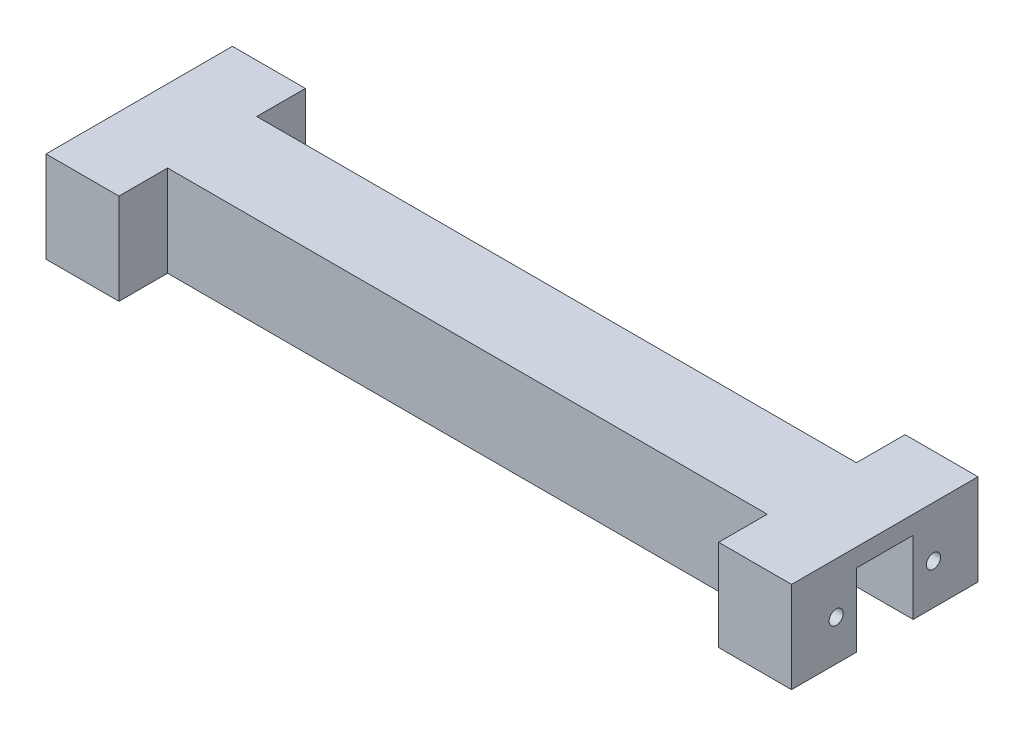
ISO-10303-21;
HEADER;
FILE_DESCRIPTION(('STEP AP214'),'2;1');
FILE_NAME('part.step','',(''),(''),'','','');
FILE_SCHEMA(('AUTOMOTIVE_DESIGN { 1 0 10303 214 1 1 1 1 }'));
ENDSEC;
DATA;
#1=APPLICATION_CONTEXT('core data for automotive mechanical design processes');
#2=APPLICATION_PROTOCOL_DEFINITION('international standard','automotive_design',2000,#1);
#3=PRODUCT_CONTEXT('',#1,'mechanical');
#4=PRODUCT('Part','Part','',(#3));
#5=PRODUCT_RELATED_PRODUCT_CATEGORY('part','',(#4));
#6=PRODUCT_DEFINITION_FORMATION('','',#4);
#7=PRODUCT_DEFINITION_CONTEXT('part definition',#1,'design');
#8=PRODUCT_DEFINITION('design','',#6,#7);
#9=PRODUCT_DEFINITION_SHAPE('','',#8);
#10=(LENGTH_UNIT() NAMED_UNIT(*) SI_UNIT(.MILLI.,.METRE.));
#11=(NAMED_UNIT(*) PLANE_ANGLE_UNIT() SI_UNIT($,.RADIAN.));
#12=(NAMED_UNIT(*) SI_UNIT($,.STERADIAN.) SOLID_ANGLE_UNIT());
#13=UNCERTAINTY_MEASURE_WITH_UNIT(LENGTH_MEASURE(1.E-05),#10,'distance_accuracy_value','');
#14=(GEOMETRIC_REPRESENTATION_CONTEXT(3) GLOBAL_UNCERTAINTY_ASSIGNED_CONTEXT((#13)) GLOBAL_UNIT_ASSIGNED_CONTEXT((#10,
#11,#12)) REPRESENTATION_CONTEXT('',''));
#15=CARTESIAN_POINT('',(0.,0.,0.));
#16=DIRECTION('',(0.,0.,1.));
#17=DIRECTION('',(1.,0.,0.));
#18=AXIS2_PLACEMENT_3D('',#15,#16,#17);
#19=CARTESIAN_POINT('',(-91.98222,22.5,-11.));
#20=DIRECTION('',(0.,0.,1.));
#21=DIRECTION('',(1.,0.,0.));
#22=AXIS2_PLACEMENT_3D('',#19,#20,#21);
#23=PLANE('',#22);
#24=DIRECTION('',(0.,-1.,0.));
#25=VECTOR('',#24,1.);
#26=CARTESIAN_POINT('',(-73.98222,0.,-11.));
#27=LINE('',#26,#25);
#28=CARTESIAN_POINT('',(-73.98222,22.5,-11.));
#29=VERTEX_POINT('',#28);
#30=CARTESIAN_POINT('',(-73.98222,0.,-11.));
#31=VERTEX_POINT('',#30);
#32=EDGE_CURVE('E56',#29,#31,#27,.T.);
#33=ORIENTED_EDGE('',*,*,#32,.F.);
#34=DIRECTION('',(-1.,0.,0.));
#35=VECTOR('',#34,1.);
#36=CARTESIAN_POINT('',(-91.98222,22.5,-11.));
#37=LINE('',#36,#35);
#38=CARTESIAN_POINT('',(73.98222,22.5,-11.));
#39=VERTEX_POINT('',#38);
#40=EDGE_CURVE('E265',#39,#29,#37,.T.);
#41=ORIENTED_EDGE('',*,*,#40,.F.);
#42=DIRECTION('',(0.,1.,0.));
#43=VECTOR('',#42,1.);
#44=CARTESIAN_POINT('',(73.98222,0.,-11.));
#45=LINE('',#44,#43);
#46=CARTESIAN_POINT('',(73.98222,0.,-11.));
#47=VERTEX_POINT('',#46);
#48=EDGE_CURVE('E179',#47,#39,#45,.T.);
#49=ORIENTED_EDGE('',*,*,#48,.F.);
#50=DIRECTION('',(-1.,0.,0.));
#51=VECTOR('',#50,1.);
#52=CARTESIAN_POINT('',(-91.98222,0.,-11.));
#53=LINE('',#52,#51);
#54=EDGE_CURVE('E61',#47,#31,#53,.T.);
#55=ORIENTED_EDGE('',*,*,#54,.T.);
#56=EDGE_LOOP('',(#33,#41,#49,#55));
#57=FACE_BOUND('',#56,.T.);
#58=ADVANCED_FACE('F39',(#57),#23,.F.);
#59=CARTESIAN_POINT('',(-91.98222,22.5,11.));
#60=DIRECTION('',(0.,0.,-1.));
#61=DIRECTION('',(-1.,0.,0.));
#62=AXIS2_PLACEMENT_3D('',#59,#60,#61);
#63=PLANE('',#62);
#64=DIRECTION('',(0.,-1.,0.));
#65=VECTOR('',#64,1.);
#66=CARTESIAN_POINT('',(73.98222,0.,11.));
#67=LINE('',#66,#65);
#68=CARTESIAN_POINT('',(73.98222,22.5,11.));
#69=VERTEX_POINT('',#68);
#70=CARTESIAN_POINT('',(73.98222,0.,11.));
#71=VERTEX_POINT('',#70);
#72=EDGE_CURVE('E208',#69,#71,#67,.T.);
#73=ORIENTED_EDGE('',*,*,#72,.F.);
#74=DIRECTION('',(1.,0.,0.));
#75=VECTOR('',#74,1.);
#76=CARTESIAN_POINT('',(-91.98222,22.5,11.));
#77=LINE('',#76,#75);
#78=CARTESIAN_POINT('',(-73.98222,22.5,11.));
#79=VERTEX_POINT('',#78);
#80=EDGE_CURVE('E11',#79,#69,#77,.T.);
#81=ORIENTED_EDGE('',*,*,#80,.F.);
#82=DIRECTION('',(0.,1.,0.));
#83=VECTOR('',#82,1.);
#84=CARTESIAN_POINT('',(-73.98222,0.,11.));
#85=LINE('',#84,#83);
#86=CARTESIAN_POINT('',(-73.98222,0.,11.));
#87=VERTEX_POINT('',#86);
#88=EDGE_CURVE('E210',#87,#79,#85,.T.);
#89=ORIENTED_EDGE('',*,*,#88,.F.);
#90=DIRECTION('',(1.,0.,0.));
#91=VECTOR('',#90,1.);
#92=CARTESIAN_POINT('',(-91.98222,0.,11.));
#93=LINE('',#92,#91);
#94=EDGE_CURVE('E43',#87,#71,#93,.T.);
#95=ORIENTED_EDGE('',*,*,#94,.T.);
#96=EDGE_LOOP('',(#73,#81,#89,#95));
#97=FACE_BOUND('',#96,.T.);
#98=ADVANCED_FACE('F348',(#97),#63,.F.);
#99=CARTESIAN_POINT('',(0.,0.,0.));
#100=DIRECTION('',(0.,1.,0.));
#101=DIRECTION('',(0.,0.,1.));
#102=AXIS2_PLACEMENT_3D('',#99,#100,#101);
#103=PLANE('',#102);
#104=DIRECTION('',(0.,0.,1.));
#105=VECTOR('',#104,1.);
#106=CARTESIAN_POINT('',(-91.98222,0.,-11.));
#107=LINE('',#106,#105);
#108=CARTESIAN_POINT('',(-91.98222,0.,7.));
#109=VERTEX_POINT('',#108);
#110=CARTESIAN_POINT('',(-91.98222,0.,23.));
#111=VERTEX_POINT('',#110);
#112=EDGE_CURVE('E163',#109,#111,#107,.T.);
#113=ORIENTED_EDGE('',*,*,#112,.F.);
#114=DIRECTION('',(-1.,0.,0.));
#115=VECTOR('',#114,1.);
#116=CARTESIAN_POINT('',(-91.98222,0.,7.));
#117=LINE('',#116,#115);
#118=CARTESIAN_POINT('',(91.98222,0.,7.));
#119=VERTEX_POINT('',#118);
#120=EDGE_CURVE('E242',#119,#109,#117,.T.);
#121=ORIENTED_EDGE('',*,*,#120,.F.);
#122=DIRECTION('',(0.,0.,-1.));
#123=VECTOR('',#122,1.);
#124=CARTESIAN_POINT('',(91.98222,0.,-11.));
#125=LINE('',#124,#123);
#126=CARTESIAN_POINT('',(91.98222,0.,23.));
#127=VERTEX_POINT('',#126);
#128=EDGE_CURVE('E268',#127,#119,#125,.T.);
#129=ORIENTED_EDGE('',*,*,#128,.F.);
#130=DIRECTION('',(1.,0.,0.));
#131=VECTOR('',#130,1.);
#132=CARTESIAN_POINT('',(91.98222,0.,23.));
#133=LINE('',#132,#131);
#134=CARTESIAN_POINT('',(73.98222,0.,23.));
#135=VERTEX_POINT('',#134);
#136=EDGE_CURVE('E207',#135,#127,#133,.T.);
#137=ORIENTED_EDGE('',*,*,#136,.F.);
#138=DIRECTION('',(0.,0.,-1.));
#139=VECTOR('',#138,1.);
#140=CARTESIAN_POINT('',(73.98222,0.,23.));
#141=LINE('',#140,#139);
#142=EDGE_CURVE('E204',#135,#71,#141,.T.);
#143=ORIENTED_EDGE('',*,*,#142,.T.);
#144=ORIENTED_EDGE('',*,*,#94,.F.);
#145=DIRECTION('',(0.,0.,-1.));
#146=VECTOR('',#145,1.);
#147=CARTESIAN_POINT('',(-73.98222,0.,23.));
#148=LINE('',#147,#146);
#149=CARTESIAN_POINT('',(-73.98222,0.,23.));
#150=VERTEX_POINT('',#149);
#151=EDGE_CURVE('E235',#150,#87,#148,.T.);
#152=ORIENTED_EDGE('',*,*,#151,.F.);
#153=DIRECTION('',(1.,0.,0.));
#154=VECTOR('',#153,1.);
#155=CARTESIAN_POINT('',(-91.98222,0.,23.));
#156=LINE('',#155,#154);
#157=EDGE_CURVE('E223',#111,#150,#156,.T.);
#158=ORIENTED_EDGE('',*,*,#157,.F.);
#159=EDGE_LOOP('',(#113,#121,#129,#137,#143,#144,#152,#158));
#160=FACE_BOUND('',#159,.T.);
#161=ADVANCED_FACE('F276',(#160),#103,.F.);
#162=CARTESIAN_POINT('',(91.98222,22.5,-11.));
#163=DIRECTION('',(-1.,0.,0.));
#164=DIRECTION('',(0.,0.,1.));
#165=AXIS2_PLACEMENT_3D('',#162,#163,#164);
#166=PLANE('',#165);
#167=CARTESIAN_POINT('',(91.98222,10.,12.));
#168=DIRECTION('',(1.,0.,0.));
#169=DIRECTION('',(0.,0.,-1.));
#170=AXIS2_PLACEMENT_3D('',#167,#168,#169);
#171=CIRCLE('',#170,1.7526);
#172=CARTESIAN_POINT('',(91.98222,10.,10.2474));
#173=VERTEX_POINT('',#172);
#174=EDGE_CURVE('E301',#173,#173,#171,.T.);
#175=ORIENTED_EDGE('',*,*,#174,.F.);
#176=EDGE_LOOP('',(#175));
#177=FACE_BOUND('',#176,.T.);
#178=CARTESIAN_POINT('',(91.98222,10.,-12.));
#179=DIRECTION('',(1.,0.,0.));
#180=DIRECTION('',(0.,0.,-1.));
#181=AXIS2_PLACEMENT_3D('',#178,#179,#180);
#182=CIRCLE('',#181,1.7526);
#183=CARTESIAN_POINT('',(91.98222,10.,-13.7526));
#184=VERTEX_POINT('',#183);
#185=EDGE_CURVE('E297',#184,#184,#182,.T.);
#186=ORIENTED_EDGE('',*,*,#185,.F.);
#187=EDGE_LOOP('',(#186));
#188=FACE_BOUND('',#187,.T.);
#189=ORIENTED_EDGE('',*,*,#128,.T.);
#190=DIRECTION('',(0.,-1.,0.));
#191=VECTOR('',#190,1.);
#192=CARTESIAN_POINT('',(91.98222,18.,7.));
#193=LINE('',#192,#191);
#194=CARTESIAN_POINT('',(91.98222,18.,7.));
#195=VERTEX_POINT('',#194);
#196=EDGE_CURVE('E257',#195,#119,#193,.T.);
#197=ORIENTED_EDGE('',*,*,#196,.F.);
#198=DIRECTION('',(0.,0.,1.));
#199=VECTOR('',#198,1.);
#200=CARTESIAN_POINT('',(91.98222,18.,-7.));
#201=LINE('',#200,#199);
#202=CARTESIAN_POINT('',(91.98222,18.,-7.));
#203=VERTEX_POINT('',#202);
#204=EDGE_CURVE('E245',#203,#195,#201,.T.);
#205=ORIENTED_EDGE('',*,*,#204,.F.);
#206=DIRECTION('',(0.,-1.,0.));
#207=VECTOR('',#206,1.);
#208=CARTESIAN_POINT('',(91.98222,18.,-7.));
#209=LINE('',#208,#207);
#210=CARTESIAN_POINT('',(91.98222,0.,-7.));
#211=VERTEX_POINT('',#210);
#212=EDGE_CURVE('E259',#203,#211,#209,.T.);
#213=ORIENTED_EDGE('',*,*,#212,.T.);
#214=CARTESIAN_POINT('',(91.98222,0.,-23.));
#215=VERTEX_POINT('',#214);
#216=EDGE_CURVE('E256',#211,#215,#125,.T.);
#217=ORIENTED_EDGE('',*,*,#216,.T.);
#218=DIRECTION('',(0.,-1.,0.));
#219=VECTOR('',#218,1.);
#220=CARTESIAN_POINT('',(91.98222,0.,-23.));
#221=LINE('',#220,#219);
#222=CARTESIAN_POINT('',(91.98222,22.5,-23.));
#223=VERTEX_POINT('',#222);
#224=EDGE_CURVE('E184',#223,#215,#221,.T.);
#225=ORIENTED_EDGE('',*,*,#224,.F.);
#226=DIRECTION('',(0.,0.,-1.));
#227=VECTOR('',#226,1.);
#228=CARTESIAN_POINT('',(91.98222,22.5,-11.));
#229=LINE('',#228,#227);
#230=CARTESIAN_POINT('',(91.98222,22.5,23.));
#231=VERTEX_POINT('',#230);
#232=EDGE_CURVE('E263',#231,#223,#229,.T.);
#233=ORIENTED_EDGE('',*,*,#232,.F.);
#234=DIRECTION('',(0.,1.,0.));
#235=VECTOR('',#234,1.);
#236=CARTESIAN_POINT('',(91.98222,0.,23.));
#237=LINE('',#236,#235);
#238=EDGE_CURVE('E211',#127,#231,#237,.T.);
#239=ORIENTED_EDGE('',*,*,#238,.F.);
#240=EDGE_LOOP('',(#189,#197,#205,#213,#217,#225,#233,#239));
#241=FACE_BOUND('',#240,.T.);
#242=ADVANCED_FACE('F41',(#177,#188,#241),#166,.F.);
#243=CARTESIAN_POINT('',(-91.98222,22.5,-11.));
#244=DIRECTION('',(1.,0.,0.));
#245=DIRECTION('',(0.,0.,-1.));
#246=AXIS2_PLACEMENT_3D('',#243,#244,#245);
#247=PLANE('',#246);
#248=CARTESIAN_POINT('',(-91.98222,10.,-12.));
#249=DIRECTION('',(-1.,0.,0.));
#250=DIRECTION('',(0.,0.,1.));
#251=AXIS2_PLACEMENT_3D('',#248,#249,#250);
#252=CIRCLE('',#251,1.7526);
#253=CARTESIAN_POINT('',(-91.98222,10.,-10.2474));
#254=VERTEX_POINT('',#253);
#255=EDGE_CURVE('E312',#254,#254,#252,.T.);
#256=ORIENTED_EDGE('',*,*,#255,.F.);
#257=EDGE_LOOP('',(#256));
#258=FACE_BOUND('',#257,.T.);
#259=CARTESIAN_POINT('',(-91.98222,10.,12.));
#260=DIRECTION('',(-1.,0.,0.));
#261=DIRECTION('',(0.,0.,1.));
#262=AXIS2_PLACEMENT_3D('',#259,#260,#261);
#263=CIRCLE('',#262,1.7526);
#264=CARTESIAN_POINT('',(-91.98222,10.,13.7526));
#265=VERTEX_POINT('',#264);
#266=EDGE_CURVE('E309',#265,#265,#263,.T.);
#267=ORIENTED_EDGE('',*,*,#266,.F.);
#268=EDGE_LOOP('',(#267));
#269=FACE_BOUND('',#268,.T.);
#270=DIRECTION('',(0.,0.,-1.));
#271=VECTOR('',#270,1.);
#272=CARTESIAN_POINT('',(-91.98222,18.,-7.));
#273=LINE('',#272,#271);
#274=CARTESIAN_POINT('',(-91.98222,18.,7.));
#275=VERTEX_POINT('',#274);
#276=CARTESIAN_POINT('',(-91.98222,18.,-7.));
#277=VERTEX_POINT('',#276);
#278=EDGE_CURVE('E238',#275,#277,#273,.T.);
#279=ORIENTED_EDGE('',*,*,#278,.F.);
#280=DIRECTION('',(0.,-1.,0.));
#281=VECTOR('',#280,1.);
#282=CARTESIAN_POINT('',(-91.98222,18.,7.));
#283=LINE('',#282,#281);
#284=EDGE_CURVE('E253',#275,#109,#283,.T.);
#285=ORIENTED_EDGE('',*,*,#284,.T.);
#286=ORIENTED_EDGE('',*,*,#112,.T.);
#287=DIRECTION('',(0.,-1.,0.));
#288=VECTOR('',#287,1.);
#289=CARTESIAN_POINT('',(-91.98222,0.,23.));
#290=LINE('',#289,#288);
#291=CARTESIAN_POINT('',(-91.98222,22.5,23.));
#292=VERTEX_POINT('',#291);
#293=EDGE_CURVE('E220',#292,#111,#290,.T.);
#294=ORIENTED_EDGE('',*,*,#293,.F.);
#295=DIRECTION('',(0.,0.,1.));
#296=VECTOR('',#295,1.);
#297=CARTESIAN_POINT('',(-91.98222,22.5,-11.));
#298=LINE('',#297,#296);
#299=CARTESIAN_POINT('',(-91.98222,22.5,-23.));
#300=VERTEX_POINT('',#299);
#301=EDGE_CURVE('E48',#300,#292,#298,.T.);
#302=ORIENTED_EDGE('',*,*,#301,.F.);
#303=DIRECTION('',(0.,1.,0.));
#304=VECTOR('',#303,1.);
#305=CARTESIAN_POINT('',(-91.98222,0.,-23.));
#306=LINE('',#305,#304);
#307=CARTESIAN_POINT('',(-91.98222,0.,-23.));
#308=VERTEX_POINT('',#307);
#309=EDGE_CURVE('E167',#308,#300,#306,.T.);
#310=ORIENTED_EDGE('',*,*,#309,.F.);
#311=CARTESIAN_POINT('',(-91.98222,0.,-7.));
#312=VERTEX_POINT('',#311);
#313=EDGE_CURVE('E153',#308,#312,#107,.T.);
#314=ORIENTED_EDGE('',*,*,#313,.T.);
#315=DIRECTION('',(0.,-1.,0.));
#316=VECTOR('',#315,1.);
#317=CARTESIAN_POINT('',(-91.98222,18.,-7.));
#318=LINE('',#317,#316);
#319=EDGE_CURVE('E250',#277,#312,#318,.T.);
#320=ORIENTED_EDGE('',*,*,#319,.F.);
#321=EDGE_LOOP('',(#279,#285,#286,#294,#302,#310,#314,#320));
#322=FACE_BOUND('',#321,.T.);
#323=ADVANCED_FACE('F174',(#258,#269,#322),#247,.F.);
#324=CARTESIAN_POINT('',(0.,22.5,0.));
#325=DIRECTION('',(0.,1.,0.));
#326=DIRECTION('',(0.,0.,1.));
#327=AXIS2_PLACEMENT_3D('',#324,#325,#326);
#328=PLANE('',#327);
#329=ORIENTED_EDGE('',*,*,#232,.T.);
#330=DIRECTION('',(1.,0.,0.));
#331=VECTOR('',#330,1.);
#332=CARTESIAN_POINT('',(91.98222,22.5,-23.));
#333=LINE('',#332,#331);
#334=CARTESIAN_POINT('',(73.98222,22.5,-23.));
#335=VERTEX_POINT('',#334);
#336=EDGE_CURVE('E191',#335,#223,#333,.T.);
#337=ORIENTED_EDGE('',*,*,#336,.F.);
#338=DIRECTION('',(0.,0.,1.));
#339=VECTOR('',#338,1.);
#340=CARTESIAN_POINT('',(73.98222,22.5,-23.));
#341=LINE('',#340,#339);
#342=EDGE_CURVE('E194',#335,#39,#341,.T.);
#343=ORIENTED_EDGE('',*,*,#342,.T.);
#344=ORIENTED_EDGE('',*,*,#40,.T.);
#345=DIRECTION('',(0.,0.,1.));
#346=VECTOR('',#345,1.);
#347=CARTESIAN_POINT('',(-73.98222,22.5,-23.));
#348=LINE('',#347,#346);
#349=CARTESIAN_POINT('',(-73.98222,22.5,-23.));
#350=VERTEX_POINT('',#349);
#351=EDGE_CURVE('E287',#350,#29,#348,.T.);
#352=ORIENTED_EDGE('',*,*,#351,.F.);
#353=DIRECTION('',(1.,0.,0.));
#354=VECTOR('',#353,1.);
#355=CARTESIAN_POINT('',(-91.98222,22.5,-23.));
#356=LINE('',#355,#354);
#357=EDGE_CURVE('E177',#300,#350,#356,.T.);
#358=ORIENTED_EDGE('',*,*,#357,.F.);
#359=ORIENTED_EDGE('',*,*,#301,.T.);
#360=DIRECTION('',(-1.,0.,0.));
#361=VECTOR('',#360,1.);
#362=CARTESIAN_POINT('',(-91.98222,22.5,23.));
#363=LINE('',#362,#361);
#364=CARTESIAN_POINT('',(-73.98222,22.5,23.));
#365=VERTEX_POINT('',#364);
#366=EDGE_CURVE('E227',#365,#292,#363,.T.);
#367=ORIENTED_EDGE('',*,*,#366,.F.);
#368=DIRECTION('',(0.,0.,-1.));
#369=VECTOR('',#368,1.);
#370=CARTESIAN_POINT('',(-73.98222,22.5,23.));
#371=LINE('',#370,#369);
#372=EDGE_CURVE('E230',#365,#79,#371,.T.);
#373=ORIENTED_EDGE('',*,*,#372,.T.);
#374=ORIENTED_EDGE('',*,*,#80,.T.);
#375=DIRECTION('',(0.,0.,-1.));
#376=VECTOR('',#375,1.);
#377=CARTESIAN_POINT('',(73.98222,22.5,23.));
#378=LINE('',#377,#376);
#379=CARTESIAN_POINT('',(73.98222,22.5,23.));
#380=VERTEX_POINT('',#379);
#381=EDGE_CURVE('E202',#380,#69,#378,.T.);
#382=ORIENTED_EDGE('',*,*,#381,.F.);
#383=DIRECTION('',(-1.,0.,0.));
#384=VECTOR('',#383,1.);
#385=CARTESIAN_POINT('',(91.98222,22.5,23.));
#386=LINE('',#385,#384);
#387=EDGE_CURVE('E216',#231,#380,#386,.T.);
#388=ORIENTED_EDGE('',*,*,#387,.F.);
#389=EDGE_LOOP('',(#329,#337,#343,#344,#352,#358,#359,#367,#373,#374,#382,#388));
#390=FACE_BOUND('',#389,.T.);
#391=ADVANCED_FACE('F284',(#390),#328,.T.);
#392=ORIENTED_EDGE('',*,*,#216,.F.);
#393=DIRECTION('',(1.,0.,0.));
#394=VECTOR('',#393,1.);
#395=CARTESIAN_POINT('',(-91.98222,0.,-7.));
#396=LINE('',#395,#394);
#397=EDGE_CURVE('E159',#312,#211,#396,.T.);
#398=ORIENTED_EDGE('',*,*,#397,.F.);
#399=ORIENTED_EDGE('',*,*,#313,.F.);
#400=DIRECTION('',(-1.,0.,0.));
#401=VECTOR('',#400,1.);
#402=CARTESIAN_POINT('',(-91.98222,0.,-23.));
#403=LINE('',#402,#401);
#404=CARTESIAN_POINT('',(-73.98222,0.,-23.));
#405=VERTEX_POINT('',#404);
#406=EDGE_CURVE('E158',#405,#308,#403,.T.);
#407=ORIENTED_EDGE('',*,*,#406,.F.);
#408=DIRECTION('',(0.,0.,1.));
#409=VECTOR('',#408,1.);
#410=CARTESIAN_POINT('',(-73.98222,0.,-23.));
#411=LINE('',#410,#409);
#412=EDGE_CURVE('E171',#405,#31,#411,.T.);
#413=ORIENTED_EDGE('',*,*,#412,.T.);
#414=ORIENTED_EDGE('',*,*,#54,.F.);
#415=DIRECTION('',(0.,0.,1.));
#416=VECTOR('',#415,1.);
#417=CARTESIAN_POINT('',(73.98222,0.,-23.));
#418=LINE('',#417,#416);
#419=CARTESIAN_POINT('',(73.98222,0.,-23.));
#420=VERTEX_POINT('',#419);
#421=EDGE_CURVE('E199',#420,#47,#418,.T.);
#422=ORIENTED_EDGE('',*,*,#421,.F.);
#423=DIRECTION('',(-1.,0.,0.));
#424=VECTOR('',#423,1.);
#425=CARTESIAN_POINT('',(91.98222,0.,-23.));
#426=LINE('',#425,#424);
#427=EDGE_CURVE('E187',#215,#420,#426,.T.);
#428=ORIENTED_EDGE('',*,*,#427,.F.);
#429=EDGE_LOOP('',(#392,#398,#399,#407,#413,#414,#422,#428));
#430=FACE_BOUND('',#429,.T.);
#431=ADVANCED_FACE('F156',(#430),#103,.F.);
#432=CARTESIAN_POINT('',(-91.98222,18.,7.));
#433=DIRECTION('',(0.,0.,1.));
#434=DIRECTION('',(1.,0.,0.));
#435=AXIS2_PLACEMENT_3D('',#432,#433,#434);
#436=PLANE('',#435);
#437=ORIENTED_EDGE('',*,*,#120,.T.);
#438=ORIENTED_EDGE('',*,*,#284,.F.);
#439=DIRECTION('',(-1.,0.,0.));
#440=VECTOR('',#439,1.);
#441=CARTESIAN_POINT('',(-91.98222,18.,7.));
#442=LINE('',#441,#440);
#443=EDGE_CURVE('E247',#195,#275,#442,.T.);
#444=ORIENTED_EDGE('',*,*,#443,.F.);
#445=ORIENTED_EDGE('',*,*,#196,.T.);
#446=EDGE_LOOP('',(#437,#438,#444,#445));
#447=FACE_BOUND('',#446,.T.);
#448=ADVANCED_FACE('F359',(#447),#436,.F.);
#449=CARTESIAN_POINT('',(-91.98222,18.,-7.));
#450=DIRECTION('',(0.,0.,-1.));
#451=DIRECTION('',(-1.,0.,0.));
#452=AXIS2_PLACEMENT_3D('',#449,#450,#451);
#453=PLANE('',#452);
#454=ORIENTED_EDGE('',*,*,#397,.T.);
#455=ORIENTED_EDGE('',*,*,#212,.F.);
#456=DIRECTION('',(1.,0.,0.));
#457=VECTOR('',#456,1.);
#458=CARTESIAN_POINT('',(-91.98222,18.,-7.));
#459=LINE('',#458,#457);
#460=EDGE_CURVE('E241',#277,#203,#459,.T.);
#461=ORIENTED_EDGE('',*,*,#460,.F.);
#462=ORIENTED_EDGE('',*,*,#319,.T.);
#463=EDGE_LOOP('',(#454,#455,#461,#462));
#464=FACE_BOUND('',#463,.T.);
#465=ADVANCED_FACE('F361',(#464),#453,.F.);
#466=CARTESIAN_POINT('',(0.,18.,0.));
#467=DIRECTION('',(0.,1.,0.));
#468=DIRECTION('',(0.,0.,1.));
#469=AXIS2_PLACEMENT_3D('',#466,#467,#468);
#470=PLANE('',#469);
#471=ORIENTED_EDGE('',*,*,#278,.T.);
#472=ORIENTED_EDGE('',*,*,#460,.T.);
#473=ORIENTED_EDGE('',*,*,#204,.T.);
#474=ORIENTED_EDGE('',*,*,#443,.T.);
#475=EDGE_LOOP('',(#471,#472,#473,#474));
#476=FACE_BOUND('',#475,.T.);
#477=ADVANCED_FACE('F364',(#476),#470,.F.);
#478=CARTESIAN_POINT('',(-73.98222,0.,23.));
#479=DIRECTION('',(-1.,0.,0.));
#480=DIRECTION('',(0.,0.,1.));
#481=AXIS2_PLACEMENT_3D('',#478,#479,#480);
#482=PLANE('',#481);
#483=ORIENTED_EDGE('',*,*,#88,.T.);
#484=ORIENTED_EDGE('',*,*,#372,.F.);
#485=DIRECTION('',(0.,1.,0.));
#486=VECTOR('',#485,1.);
#487=CARTESIAN_POINT('',(-73.98222,0.,23.));
#488=LINE('',#487,#486);
#489=EDGE_CURVE('E225',#150,#365,#488,.T.);
#490=ORIENTED_EDGE('',*,*,#489,.F.);
#491=ORIENTED_EDGE('',*,*,#151,.T.);
#492=EDGE_LOOP('',(#483,#484,#490,#491));
#493=FACE_BOUND('',#492,.T.);
#494=ADVANCED_FACE('F371',(#493),#482,.F.);
#495=CARTESIAN_POINT('',(0.,0.,23.));
#496=DIRECTION('',(0.,0.,-1.));
#497=DIRECTION('',(-1.,0.,0.));
#498=AXIS2_PLACEMENT_3D('',#495,#496,#497);
#499=PLANE('',#498);
#500=ORIENTED_EDGE('',*,*,#293,.T.);
#501=ORIENTED_EDGE('',*,*,#157,.T.);
#502=ORIENTED_EDGE('',*,*,#489,.T.);
#503=ORIENTED_EDGE('',*,*,#366,.T.);
#504=EDGE_LOOP('',(#500,#501,#502,#503));
#505=FACE_BOUND('',#504,.T.);
#506=ADVANCED_FACE('F280',(#505),#499,.F.);
#507=CARTESIAN_POINT('',(73.98222,0.,23.));
#508=DIRECTION('',(1.,0.,0.));
#509=DIRECTION('',(0.,0.,-1.));
#510=AXIS2_PLACEMENT_3D('',#507,#508,#509);
#511=PLANE('',#510);
#512=ORIENTED_EDGE('',*,*,#72,.T.);
#513=ORIENTED_EDGE('',*,*,#142,.F.);
#514=DIRECTION('',(0.,-1.,0.));
#515=VECTOR('',#514,1.);
#516=CARTESIAN_POINT('',(73.98222,0.,23.));
#517=LINE('',#516,#515);
#518=EDGE_CURVE('E214',#380,#135,#517,.T.);
#519=ORIENTED_EDGE('',*,*,#518,.F.);
#520=ORIENTED_EDGE('',*,*,#381,.T.);
#521=EDGE_LOOP('',(#512,#513,#519,#520));
#522=FACE_BOUND('',#521,.T.);
#523=ADVANCED_FACE('F378',(#522),#511,.F.);
#524=CARTESIAN_POINT('',(0.,0.,23.));
#525=DIRECTION('',(0.,0.,1.));
#526=DIRECTION('',(1.,0.,0.));
#527=AXIS2_PLACEMENT_3D('',#524,#525,#526);
#528=PLANE('',#527);
#529=ORIENTED_EDGE('',*,*,#238,.T.);
#530=ORIENTED_EDGE('',*,*,#387,.T.);
#531=ORIENTED_EDGE('',*,*,#518,.T.);
#532=ORIENTED_EDGE('',*,*,#136,.T.);
#533=EDGE_LOOP('',(#529,#530,#531,#532));
#534=FACE_BOUND('',#533,.T.);
#535=ADVANCED_FACE('F379',(#534),#528,.T.);
#536=CARTESIAN_POINT('',(73.98222,0.,-23.));
#537=DIRECTION('',(1.,0.,0.));
#538=DIRECTION('',(0.,0.,-1.));
#539=AXIS2_PLACEMENT_3D('',#536,#537,#538);
#540=PLANE('',#539);
#541=ORIENTED_EDGE('',*,*,#48,.T.);
#542=ORIENTED_EDGE('',*,*,#342,.F.);
#543=DIRECTION('',(0.,1.,0.));
#544=VECTOR('',#543,1.);
#545=CARTESIAN_POINT('',(73.98222,0.,-23.));
#546=LINE('',#545,#544);
#547=EDGE_CURVE('E189',#420,#335,#546,.T.);
#548=ORIENTED_EDGE('',*,*,#547,.F.);
#549=ORIENTED_EDGE('',*,*,#421,.T.);
#550=EDGE_LOOP('',(#541,#542,#548,#549));
#551=FACE_BOUND('',#550,.T.);
#552=ADVANCED_FACE('F381',(#551),#540,.F.);
#553=CARTESIAN_POINT('',(0.,0.,-23.));
#554=DIRECTION('',(0.,0.,1.));
#555=DIRECTION('',(1.,0.,0.));
#556=AXIS2_PLACEMENT_3D('',#553,#554,#555);
#557=PLANE('',#556);
#558=ORIENTED_EDGE('',*,*,#224,.T.);
#559=ORIENTED_EDGE('',*,*,#427,.T.);
#560=ORIENTED_EDGE('',*,*,#547,.T.);
#561=ORIENTED_EDGE('',*,*,#336,.T.);
#562=EDGE_LOOP('',(#558,#559,#560,#561));
#563=FACE_BOUND('',#562,.T.);
#564=ADVANCED_FACE('F388',(#563),#557,.F.);
#565=CARTESIAN_POINT('',(-73.98222,0.,-23.));
#566=DIRECTION('',(-1.,0.,0.));
#567=DIRECTION('',(0.,0.,1.));
#568=AXIS2_PLACEMENT_3D('',#565,#566,#567);
#569=PLANE('',#568);
#570=ORIENTED_EDGE('',*,*,#32,.T.);
#571=ORIENTED_EDGE('',*,*,#412,.F.);
#572=DIRECTION('',(0.,-1.,0.));
#573=VECTOR('',#572,1.);
#574=CARTESIAN_POINT('',(-73.98222,0.,-23.));
#575=LINE('',#574,#573);
#576=EDGE_CURVE('E169',#350,#405,#575,.T.);
#577=ORIENTED_EDGE('',*,*,#576,.F.);
#578=ORIENTED_EDGE('',*,*,#351,.T.);
#579=EDGE_LOOP('',(#570,#571,#577,#578));
#580=FACE_BOUND('',#579,.T.);
#581=ADVANCED_FACE('F291',(#580),#569,.F.);
#582=CARTESIAN_POINT('',(0.,0.,-23.));
#583=DIRECTION('',(0.,0.,-1.));
#584=DIRECTION('',(-1.,0.,0.));
#585=AXIS2_PLACEMENT_3D('',#582,#583,#584);
#586=PLANE('',#585);
#587=ORIENTED_EDGE('',*,*,#309,.T.);
#588=ORIENTED_EDGE('',*,*,#357,.T.);
#589=ORIENTED_EDGE('',*,*,#576,.T.);
#590=ORIENTED_EDGE('',*,*,#406,.T.);
#591=EDGE_LOOP('',(#587,#588,#589,#590));
#592=FACE_BOUND('',#591,.T.);
#593=ADVANCED_FACE('F166',(#592),#586,.T.);
#594=CARTESIAN_POINT('',(75.98222,10.,-12.));
#595=DIRECTION('',(1.,0.,0.));
#596=DIRECTION('',(0.,0.,-1.));
#597=AXIS2_PLACEMENT_3D('',#594,#595,#596);
#598=CYLINDRICAL_SURFACE('',#597,1.7526);
#599=CARTESIAN_POINT('',(75.98222,10.,-12.));
#600=DIRECTION('',(1.,0.,0.));
#601=DIRECTION('',(0.,0.,-1.));
#602=AXIS2_PLACEMENT_3D('',#599,#600,#601);
#603=CIRCLE('',#602,1.7526);
#604=CARTESIAN_POINT('',(75.98222,10.,-13.7526));
#605=VERTEX_POINT('',#604);
#606=EDGE_CURVE('E294',#605,#605,#603,.T.);
#607=ORIENTED_EDGE('',*,*,#606,.F.);
#608=EDGE_LOOP('',(#607));
#609=FACE_BOUND('',#608,.T.);
#610=ORIENTED_EDGE('',*,*,#185,.T.);
#611=EDGE_LOOP('',(#610));
#612=FACE_BOUND('',#611,.T.);
#613=ADVANCED_FACE('F395',(#609,#612),#598,.F.);
#614=CARTESIAN_POINT('',(75.98222,10.,-12.));
#615=DIRECTION('',(1.,0.,0.));
#616=DIRECTION('',(0.,0.,-1.));
#617=AXIS2_PLACEMENT_3D('',#614,#615,#616);
#618=PLANE('',#617);
#619=ORIENTED_EDGE('',*,*,#606,.T.);
#620=EDGE_LOOP('',(#619));
#621=FACE_BOUND('',#620,.T.);
#622=ADVANCED_FACE('F398',(#621),#618,.T.);
#623=CARTESIAN_POINT('',(75.98222,10.,12.));
#624=DIRECTION('',(1.,0.,0.));
#625=DIRECTION('',(0.,0.,-1.));
#626=AXIS2_PLACEMENT_3D('',#623,#624,#625);
#627=CYLINDRICAL_SURFACE('',#626,1.7526);
#628=CARTESIAN_POINT('',(75.98222,10.,12.));
#629=DIRECTION('',(1.,0.,0.));
#630=DIRECTION('',(0.,0.,-1.));
#631=AXIS2_PLACEMENT_3D('',#628,#629,#630);
#632=CIRCLE('',#631,1.7526);
#633=CARTESIAN_POINT('',(75.98222,10.,10.2474));
#634=VERTEX_POINT('',#633);
#635=EDGE_CURVE('E289',#634,#634,#632,.T.);
#636=ORIENTED_EDGE('',*,*,#635,.F.);
#637=EDGE_LOOP('',(#636));
#638=FACE_BOUND('',#637,.T.);
#639=ORIENTED_EDGE('',*,*,#174,.T.);
#640=EDGE_LOOP('',(#639));
#641=FACE_BOUND('',#640,.T.);
#642=ADVANCED_FACE('F343',(#638,#641),#627,.F.);
#643=CARTESIAN_POINT('',(75.98222,10.,12.));
#644=DIRECTION('',(1.,0.,0.));
#645=DIRECTION('',(0.,0.,-1.));
#646=AXIS2_PLACEMENT_3D('',#643,#644,#645);
#647=PLANE('',#646);
#648=ORIENTED_EDGE('',*,*,#635,.T.);
#649=EDGE_LOOP('',(#648));
#650=FACE_BOUND('',#649,.T.);
#651=ADVANCED_FACE('F334',(#650),#647,.T.);
#652=CARTESIAN_POINT('',(-75.98222,10.,12.));
#653=DIRECTION('',(-1.,0.,0.));
#654=DIRECTION('',(0.,0.,1.));
#655=AXIS2_PLACEMENT_3D('',#652,#653,#654);
#656=CYLINDRICAL_SURFACE('',#655,1.7526);
#657=CARTESIAN_POINT('',(-75.98222,10.,12.));
#658=DIRECTION('',(-1.,0.,0.));
#659=DIRECTION('',(0.,0.,1.));
#660=AXIS2_PLACEMENT_3D('',#657,#658,#659);
#661=CIRCLE('',#660,1.7526);
#662=CARTESIAN_POINT('',(-75.98222,10.,13.7526));
#663=VERTEX_POINT('',#662);
#664=EDGE_CURVE('E306',#663,#663,#661,.T.);
#665=ORIENTED_EDGE('',*,*,#664,.F.);
#666=EDGE_LOOP('',(#665));
#667=FACE_BOUND('',#666,.T.);
#668=ORIENTED_EDGE('',*,*,#266,.T.);
#669=EDGE_LOOP('',(#668));
#670=FACE_BOUND('',#669,.T.);
#671=ADVANCED_FACE('F332',(#667,#670),#656,.F.);
#672=CARTESIAN_POINT('',(-75.98222,10.,12.));
#673=DIRECTION('',(-1.,0.,0.));
#674=DIRECTION('',(0.,0.,1.));
#675=AXIS2_PLACEMENT_3D('',#672,#673,#674);
#676=PLANE('',#675);
#677=ORIENTED_EDGE('',*,*,#664,.T.);
#678=EDGE_LOOP('',(#677));
#679=FACE_BOUND('',#678,.T.);
#680=ADVANCED_FACE('F323',(#679),#676,.T.);
#681=CARTESIAN_POINT('',(-75.98222,10.,-12.));
#682=DIRECTION('',(-1.,0.,0.));
#683=DIRECTION('',(0.,0.,1.));
#684=AXIS2_PLACEMENT_3D('',#681,#682,#683);
#685=CYLINDRICAL_SURFACE('',#684,1.7526);
#686=CARTESIAN_POINT('',(-75.98222,10.,-12.));
#687=DIRECTION('',(-1.,0.,0.));
#688=DIRECTION('',(0.,0.,1.));
#689=AXIS2_PLACEMENT_3D('',#686,#687,#688);
#690=CIRCLE('',#689,1.7526);
#691=CARTESIAN_POINT('',(-75.98222,10.,-10.2474));
#692=VERTEX_POINT('',#691);
#693=EDGE_CURVE('E298',#692,#692,#690,.T.);
#694=ORIENTED_EDGE('',*,*,#693,.F.);
#695=EDGE_LOOP('',(#694));
#696=FACE_BOUND('',#695,.T.);
#697=ORIENTED_EDGE('',*,*,#255,.T.);
#698=EDGE_LOOP('',(#697));
#699=FACE_BOUND('',#698,.T.);
#700=ADVANCED_FACE('F320',(#696,#699),#685,.F.);
#701=CARTESIAN_POINT('',(-75.98222,10.,-12.));
#702=DIRECTION('',(-1.,0.,0.));
#703=DIRECTION('',(0.,0.,1.));
#704=AXIS2_PLACEMENT_3D('',#701,#702,#703);
#705=PLANE('',#704);
#706=ORIENTED_EDGE('',*,*,#693,.T.);
#707=EDGE_LOOP('',(#706));
#708=FACE_BOUND('',#707,.T.);
#709=ADVANCED_FACE('F318',(#708),#705,.T.);
#710=CLOSED_SHELL('',(#58,#98,#161,#242,#323,#391,#431,#448,#465,#477,#494,#506,#523,#535,#552,
#564,#581,#593,#613,#622,#642,#651,#671,#680,#700,#709));
#711=MANIFOLD_SOLID_BREP('B2',#710);
#712=ADVANCED_BREP_SHAPE_REPRESENTATION('',(#18,#711),#14);
#713=SHAPE_DEFINITION_REPRESENTATION(#9,#712);
ENDSEC;
END-ISO-10303-21;
